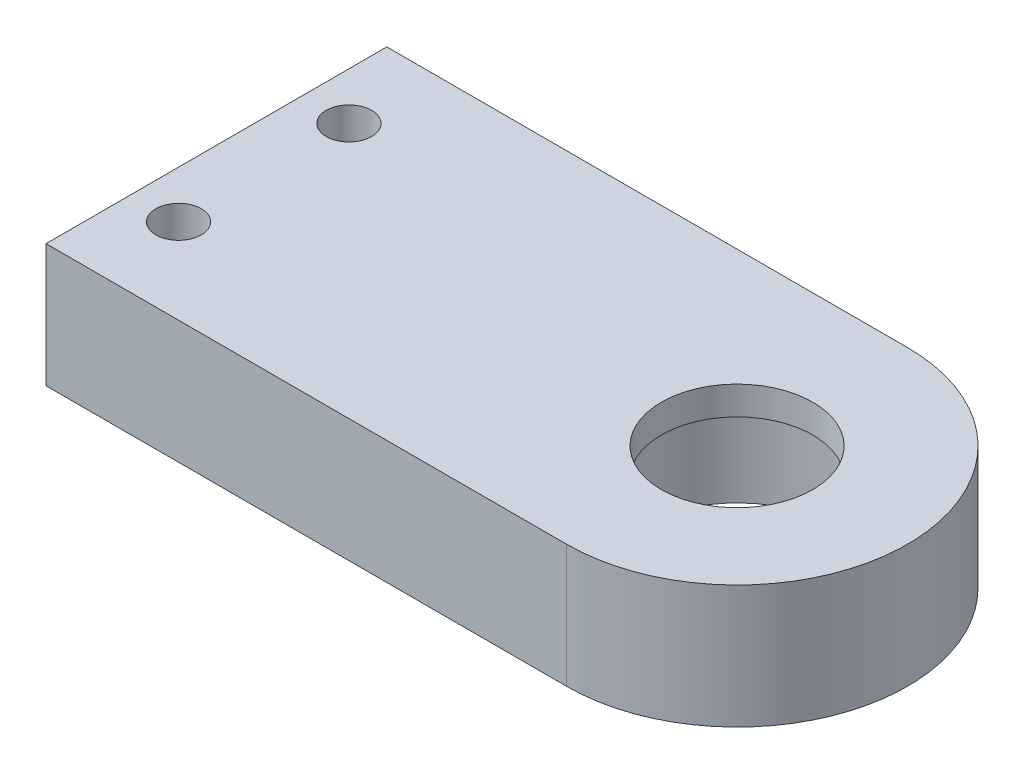
ISO-10303-21;
HEADER;
FILE_DESCRIPTION(('STEP AP214'),'2;1');
FILE_NAME('part.step','',(''),(''),'','','');
FILE_SCHEMA(('AUTOMOTIVE_DESIGN { 1 0 10303 214 1 1 1 1 }'));
ENDSEC;
DATA;
#1=APPLICATION_CONTEXT('core data for automotive mechanical design processes');
#2=APPLICATION_PROTOCOL_DEFINITION('international standard','automotive_design',2000,#1);
#3=PRODUCT_CONTEXT('',#1,'mechanical');
#4=PRODUCT('Part','Part','',(#3));
#5=PRODUCT_RELATED_PRODUCT_CATEGORY('part','',(#4));
#6=PRODUCT_DEFINITION_FORMATION('','',#4);
#7=PRODUCT_DEFINITION_CONTEXT('part definition',#1,'design');
#8=PRODUCT_DEFINITION('design','',#6,#7);
#9=PRODUCT_DEFINITION_SHAPE('','',#8);
#10=(LENGTH_UNIT() NAMED_UNIT(*) SI_UNIT(.MILLI.,.METRE.));
#11=(NAMED_UNIT(*) PLANE_ANGLE_UNIT() SI_UNIT($,.RADIAN.));
#12=(NAMED_UNIT(*) SI_UNIT($,.STERADIAN.) SOLID_ANGLE_UNIT());
#13=UNCERTAINTY_MEASURE_WITH_UNIT(LENGTH_MEASURE(1.E-05),#10,'distance_accuracy_value','');
#14=(GEOMETRIC_REPRESENTATION_CONTEXT(3) GLOBAL_UNCERTAINTY_ASSIGNED_CONTEXT((#13)) GLOBAL_UNIT_ASSIGNED_CONTEXT((#10,
#11,#12)) REPRESENTATION_CONTEXT('',''));
#15=CARTESIAN_POINT('',(0.,0.,0.));
#16=DIRECTION('',(0.,0.,1.));
#17=DIRECTION('',(1.,0.,0.));
#18=AXIS2_PLACEMENT_3D('',#15,#16,#17);
#19=CARTESIAN_POINT('',(5.5,31.3,0.));
#20=DIRECTION('',(0.,-1.,0.));
#21=DIRECTION('',(0.,0.,-1.));
#22=AXIS2_PLACEMENT_3D('',#19,#20,#21);
#23=CYLINDRICAL_SURFACE('',#22,9.);
#24=CARTESIAN_POINT('',(5.5,24.8,0.));
#25=DIRECTION('',(0.,1.,0.));
#26=DIRECTION('',(0.,0.,1.));
#27=AXIS2_PLACEMENT_3D('',#24,#25,#26);
#28=CIRCLE('',#27,9.);
#29=CARTESIAN_POINT('',(5.5,24.8,9.));
#30=VERTEX_POINT('',#29);
#31=CARTESIAN_POINT('',(5.5,24.8,-9.));
#32=VERTEX_POINT('',#31);
#33=EDGE_CURVE('E100',#30,#32,#28,.T.);
#34=ORIENTED_EDGE('',*,*,#33,.T.);
#35=DIRECTION('',(0.,-1.,0.));
#36=VECTOR('',#35,1.);
#37=CARTESIAN_POINT('',(5.5,31.3,-9.));
#38=LINE('',#37,#36);
#39=CARTESIAN_POINT('',(5.5,31.3,-9.));
#40=VERTEX_POINT('',#39);
#41=EDGE_CURVE('E11',#40,#32,#38,.T.);
#42=ORIENTED_EDGE('',*,*,#41,.F.);
#43=CARTESIAN_POINT('',(5.5,31.3,0.));
#44=DIRECTION('',(0.,1.,0.));
#45=DIRECTION('',(0.,0.,1.));
#46=AXIS2_PLACEMENT_3D('',#43,#44,#45);
#47=CIRCLE('',#46,9.);
#48=CARTESIAN_POINT('',(5.5,31.3,9.));
#49=VERTEX_POINT('',#48);
#50=EDGE_CURVE('E88',#49,#40,#47,.T.);
#51=ORIENTED_EDGE('',*,*,#50,.F.);
#52=DIRECTION('',(0.,-1.,0.));
#53=VECTOR('',#52,1.);
#54=CARTESIAN_POINT('',(5.5,31.3,9.));
#55=LINE('',#54,#53);
#56=EDGE_CURVE('E96',#49,#30,#55,.T.);
#57=ORIENTED_EDGE('',*,*,#56,.T.);
#58=EDGE_LOOP('',(#34,#42,#51,#57));
#59=FACE_BOUND('',#58,.T.);
#60=ADVANCED_FACE('F37',(#59),#23,.T.);
#61=CARTESIAN_POINT('',(5.5,31.3,-9.));
#62=DIRECTION('',(0.,0.,1.));
#63=DIRECTION('',(1.,0.,0.));
#64=AXIS2_PLACEMENT_3D('',#61,#62,#63);
#65=PLANE('',#64);
#66=DIRECTION('',(-1.,0.,0.));
#67=VECTOR('',#66,1.);
#68=CARTESIAN_POINT('',(5.5,24.8,-9.));
#69=LINE('',#68,#67);
#70=CARTESIAN_POINT('',(-22.,24.8,-9.));
#71=VERTEX_POINT('',#70);
#72=EDGE_CURVE('E92',#32,#71,#69,.T.);
#73=ORIENTED_EDGE('',*,*,#72,.T.);
#74=DIRECTION('',(0.,-1.,0.));
#75=VECTOR('',#74,1.);
#76=CARTESIAN_POINT('',(-22.,31.3,-9.));
#77=LINE('',#76,#75);
#78=CARTESIAN_POINT('',(-22.,31.3,-9.));
#79=VERTEX_POINT('',#78);
#80=EDGE_CURVE('E45',#79,#71,#77,.T.);
#81=ORIENTED_EDGE('',*,*,#80,.F.);
#82=DIRECTION('',(-1.,0.,0.));
#83=VECTOR('',#82,1.);
#84=CARTESIAN_POINT('',(5.5,31.3,-9.));
#85=LINE('',#84,#83);
#86=EDGE_CURVE('E83',#40,#79,#85,.T.);
#87=ORIENTED_EDGE('',*,*,#86,.F.);
#88=ORIENTED_EDGE('',*,*,#41,.T.);
#89=EDGE_LOOP('',(#73,#81,#87,#88));
#90=FACE_BOUND('',#89,.T.);
#91=ADVANCED_FACE('F91',(#90),#65,.F.);
#92=CARTESIAN_POINT('',(-22.,31.3,-9.));
#93=DIRECTION('',(1.,0.,0.));
#94=DIRECTION('',(0.,0.,-1.));
#95=AXIS2_PLACEMENT_3D('',#92,#93,#94);
#96=PLANE('',#95);
#97=DIRECTION('',(0.,0.,1.));
#98=VECTOR('',#97,1.);
#99=CARTESIAN_POINT('',(-22.,24.8,-9.));
#100=LINE('',#99,#98);
#101=CARTESIAN_POINT('',(-22.,24.8,9.));
#102=VERTEX_POINT('',#101);
#103=EDGE_CURVE('E70',#71,#102,#100,.T.);
#104=ORIENTED_EDGE('',*,*,#103,.T.);
#105=DIRECTION('',(0.,-1.,0.));
#106=VECTOR('',#105,1.);
#107=CARTESIAN_POINT('',(-22.,31.3,9.));
#108=LINE('',#107,#106);
#109=CARTESIAN_POINT('',(-22.,31.3,9.));
#110=VERTEX_POINT('',#109);
#111=EDGE_CURVE('E93',#110,#102,#108,.T.);
#112=ORIENTED_EDGE('',*,*,#111,.F.);
#113=DIRECTION('',(0.,0.,1.));
#114=VECTOR('',#113,1.);
#115=CARTESIAN_POINT('',(-22.,31.3,-9.));
#116=LINE('',#115,#114);
#117=EDGE_CURVE('E86',#79,#110,#116,.T.);
#118=ORIENTED_EDGE('',*,*,#117,.F.);
#119=ORIENTED_EDGE('',*,*,#80,.T.);
#120=EDGE_LOOP('',(#104,#112,#118,#119));
#121=FACE_BOUND('',#120,.T.);
#122=ADVANCED_FACE('F94',(#121),#96,.F.);
#123=CARTESIAN_POINT('',(-22.,31.3,9.));
#124=DIRECTION('',(0.,0.,-1.));
#125=DIRECTION('',(-1.,0.,0.));
#126=AXIS2_PLACEMENT_3D('',#123,#124,#125);
#127=PLANE('',#126);
#128=DIRECTION('',(1.,0.,0.));
#129=VECTOR('',#128,1.);
#130=CARTESIAN_POINT('',(-22.,24.8,9.));
#131=LINE('',#130,#129);
#132=EDGE_CURVE('E76',#102,#30,#131,.T.);
#133=ORIENTED_EDGE('',*,*,#132,.T.);
#134=ORIENTED_EDGE('',*,*,#56,.F.);
#135=DIRECTION('',(1.,0.,0.));
#136=VECTOR('',#135,1.);
#137=CARTESIAN_POINT('',(-22.,31.3,9.));
#138=LINE('',#137,#136);
#139=EDGE_CURVE('E53',#110,#49,#138,.T.);
#140=ORIENTED_EDGE('',*,*,#139,.F.);
#141=ORIENTED_EDGE('',*,*,#111,.T.);
#142=EDGE_LOOP('',(#133,#134,#140,#141));
#143=FACE_BOUND('',#142,.T.);
#144=ADVANCED_FACE('F108',(#143),#127,.F.);
#145=CARTESIAN_POINT('',(5.5,31.3,0.));
#146=DIRECTION('',(0.,1.,0.));
#147=DIRECTION('',(0.,0.,1.));
#148=AXIS2_PLACEMENT_3D('',#145,#146,#147);
#149=PLANE('',#148);
#150=CARTESIAN_POINT('',(-19.5,31.3,-4.5));
#151=DIRECTION('',(0.,1.,0.));
#152=DIRECTION('',(0.,0.,1.));
#153=AXIS2_PLACEMENT_3D('',#150,#151,#152);
#154=CIRCLE('',#153,1.19999999999999);
#155=CARTESIAN_POINT('',(-19.5,31.3,-3.30000000000001));
#156=VERTEX_POINT('',#155);
#157=EDGE_CURVE('E134',#156,#156,#154,.T.);
#158=ORIENTED_EDGE('',*,*,#157,.F.);
#159=EDGE_LOOP('',(#158));
#160=FACE_BOUND('',#159,.T.);
#161=CARTESIAN_POINT('',(-19.5,31.3,4.5));
#162=DIRECTION('',(0.,1.,0.));
#163=DIRECTION('',(0.,0.,1.));
#164=AXIS2_PLACEMENT_3D('',#161,#162,#163);
#165=CIRCLE('',#164,1.19999999999999);
#166=CARTESIAN_POINT('',(-19.5,31.3,5.69999999999999));
#167=VERTEX_POINT('',#166);
#168=EDGE_CURVE('E128',#167,#167,#165,.T.);
#169=ORIENTED_EDGE('',*,*,#168,.F.);
#170=EDGE_LOOP('',(#169));
#171=FACE_BOUND('',#170,.T.);
#172=CARTESIAN_POINT('',(5.5,31.3,0.));
#173=DIRECTION('',(0.,1.,0.));
#174=DIRECTION('',(0.,0.,1.));
#175=AXIS2_PLACEMENT_3D('',#172,#173,#174);
#176=CIRCLE('',#175,4.);
#177=CARTESIAN_POINT('',(5.5,31.3,4.));
#178=VERTEX_POINT('',#177);
#179=EDGE_CURVE('E117',#178,#178,#176,.T.);
#180=ORIENTED_EDGE('',*,*,#179,.F.);
#181=EDGE_LOOP('',(#180));
#182=FACE_BOUND('',#181,.T.);
#183=ORIENTED_EDGE('',*,*,#50,.T.);
#184=ORIENTED_EDGE('',*,*,#86,.T.);
#185=ORIENTED_EDGE('',*,*,#117,.T.);
#186=ORIENTED_EDGE('',*,*,#139,.T.);
#187=EDGE_LOOP('',(#183,#184,#185,#186));
#188=FACE_BOUND('',#187,.T.);
#189=ADVANCED_FACE('F84',(#160,#171,#182,#188),#149,.T.);
#190=CARTESIAN_POINT('',(5.5,24.8,0.));
#191=DIRECTION('',(0.,1.,0.));
#192=DIRECTION('',(0.,0.,1.));
#193=AXIS2_PLACEMENT_3D('',#190,#191,#192);
#194=PLANE('',#193);
#195=CARTESIAN_POINT('',(-19.5,24.8,-4.5));
#196=DIRECTION('',(0.,1.,0.));
#197=DIRECTION('',(0.,0.,1.));
#198=AXIS2_PLACEMENT_3D('',#195,#196,#197);
#199=CIRCLE('',#198,1.19999999999999);
#200=CARTESIAN_POINT('',(-19.5,24.8,-3.30000000000001));
#201=VERTEX_POINT('',#200);
#202=EDGE_CURVE('E131',#201,#201,#199,.T.);
#203=ORIENTED_EDGE('',*,*,#202,.T.);
#204=EDGE_LOOP('',(#203));
#205=FACE_BOUND('',#204,.T.);
#206=CARTESIAN_POINT('',(-19.5,24.8,4.5));
#207=DIRECTION('',(0.,1.,0.));
#208=DIRECTION('',(0.,0.,1.));
#209=AXIS2_PLACEMENT_3D('',#206,#207,#208);
#210=CIRCLE('',#209,1.19999999999999);
#211=CARTESIAN_POINT('',(-19.5,24.8,5.69999999999999));
#212=VERTEX_POINT('',#211);
#213=EDGE_CURVE('E123',#212,#212,#210,.T.);
#214=ORIENTED_EDGE('',*,*,#213,.T.);
#215=EDGE_LOOP('',(#214));
#216=FACE_BOUND('',#215,.T.);
#217=CARTESIAN_POINT('',(5.5,24.8,0.));
#218=DIRECTION('',(0.,1.,0.));
#219=DIRECTION('',(0.,0.,1.));
#220=AXIS2_PLACEMENT_3D('',#217,#218,#219);
#221=CIRCLE('',#220,5.5);
#222=CARTESIAN_POINT('',(5.5,24.8,5.5));
#223=VERTEX_POINT('',#222);
#224=EDGE_CURVE('E114',#223,#223,#221,.T.);
#225=ORIENTED_EDGE('',*,*,#224,.T.);
#226=EDGE_LOOP('',(#225));
#227=FACE_BOUND('',#226,.T.);
#228=ORIENTED_EDGE('',*,*,#33,.F.);
#229=ORIENTED_EDGE('',*,*,#132,.F.);
#230=ORIENTED_EDGE('',*,*,#103,.F.);
#231=ORIENTED_EDGE('',*,*,#72,.F.);
#232=EDGE_LOOP('',(#228,#229,#230,#231));
#233=FACE_BOUND('',#232,.T.);
#234=ADVANCED_FACE('F111',(#205,#216,#227,#233),#194,.F.);
#235=CARTESIAN_POINT('',(5.5,29.8,0.));
#236=DIRECTION('',(0.,-1.,0.));
#237=DIRECTION('',(0.,0.,-1.));
#238=AXIS2_PLACEMENT_3D('',#235,#236,#237);
#239=CYLINDRICAL_SURFACE('',#238,5.5);
#240=CARTESIAN_POINT('',(5.5,29.8,0.));
#241=DIRECTION('',(0.,1.,0.));
#242=DIRECTION('',(0.,0.,1.));
#243=AXIS2_PLACEMENT_3D('',#240,#241,#242);
#244=CIRCLE('',#243,5.5);
#245=CARTESIAN_POINT('',(5.5,29.8,5.5));
#246=VERTEX_POINT('',#245);
#247=EDGE_CURVE('E103',#246,#246,#244,.T.);
#248=ORIENTED_EDGE('',*,*,#247,.T.);
#249=EDGE_LOOP('',(#248));
#250=FACE_BOUND('',#249,.T.);
#251=ORIENTED_EDGE('',*,*,#224,.F.);
#252=EDGE_LOOP('',(#251));
#253=FACE_BOUND('',#252,.T.);
#254=ADVANCED_FACE('F157',(#250,#253),#239,.F.);
#255=CARTESIAN_POINT('',(5.5,29.8,0.));
#256=DIRECTION('',(0.,1.,0.));
#257=DIRECTION('',(0.,0.,1.));
#258=AXIS2_PLACEMENT_3D('',#255,#256,#257);
#259=PLANE('',#258);
#260=CARTESIAN_POINT('',(5.5,29.8,0.));
#261=DIRECTION('',(0.,1.,0.));
#262=DIRECTION('',(0.,0.,1.));
#263=AXIS2_PLACEMENT_3D('',#260,#261,#262);
#264=CIRCLE('',#263,4.);
#265=CARTESIAN_POINT('',(5.5,29.8,4.));
#266=VERTEX_POINT('',#265);
#267=EDGE_CURVE('E120',#266,#266,#264,.T.);
#268=ORIENTED_EDGE('',*,*,#267,.T.);
#269=EDGE_LOOP('',(#268));
#270=FACE_BOUND('',#269,.T.);
#271=ORIENTED_EDGE('',*,*,#247,.F.);
#272=EDGE_LOOP('',(#271));
#273=FACE_BOUND('',#272,.T.);
#274=ADVANCED_FACE('F151',(#270,#273),#259,.F.);
#275=CARTESIAN_POINT('',(5.5,31.3,0.));
#276=DIRECTION('',(0.,-1.,0.));
#277=DIRECTION('',(0.,0.,-1.));
#278=AXIS2_PLACEMENT_3D('',#275,#276,#277);
#279=CYLINDRICAL_SURFACE('',#278,4.);
#280=ORIENTED_EDGE('',*,*,#179,.T.);
#281=EDGE_LOOP('',(#280));
#282=FACE_BOUND('',#281,.T.);
#283=ORIENTED_EDGE('',*,*,#267,.F.);
#284=EDGE_LOOP('',(#283));
#285=FACE_BOUND('',#284,.T.);
#286=ADVANCED_FACE('F147',(#282,#285),#279,.F.);
#287=CARTESIAN_POINT('',(-19.5,31.3,4.5));
#288=DIRECTION('',(0.,1.,0.));
#289=DIRECTION('',(0.,0.,1.));
#290=AXIS2_PLACEMENT_3D('',#287,#288,#289);
#291=CYLINDRICAL_SURFACE('',#290,1.19999999999999);
#292=ORIENTED_EDGE('',*,*,#213,.F.);
#293=EDGE_LOOP('',(#292));
#294=FACE_BOUND('',#293,.T.);
#295=ORIENTED_EDGE('',*,*,#168,.T.);
#296=EDGE_LOOP('',(#295));
#297=FACE_BOUND('',#296,.T.);
#298=ADVANCED_FACE('F150',(#294,#297),#291,.F.);
#299=CARTESIAN_POINT('',(-19.5,31.3,-4.5));
#300=DIRECTION('',(0.,1.,0.));
#301=DIRECTION('',(0.,0.,1.));
#302=AXIS2_PLACEMENT_3D('',#299,#300,#301);
#303=CYLINDRICAL_SURFACE('',#302,1.19999999999999);
#304=ORIENTED_EDGE('',*,*,#202,.F.);
#305=EDGE_LOOP('',(#304));
#306=FACE_BOUND('',#305,.T.);
#307=ORIENTED_EDGE('',*,*,#157,.T.);
#308=EDGE_LOOP('',(#307));
#309=FACE_BOUND('',#308,.T.);
#310=ADVANCED_FACE('F138',(#306,#309),#303,.F.);
#311=CLOSED_SHELL('',(#60,#91,#122,#144,#189,#234,#254,#274,#286,#298,#310));
#312=MANIFOLD_SOLID_BREP('B2',#311);
#313=ADVANCED_BREP_SHAPE_REPRESENTATION('',(#18,#312),#14);
#314=SHAPE_DEFINITION_REPRESENTATION(#9,#313);
ENDSEC;
END-ISO-10303-21;
